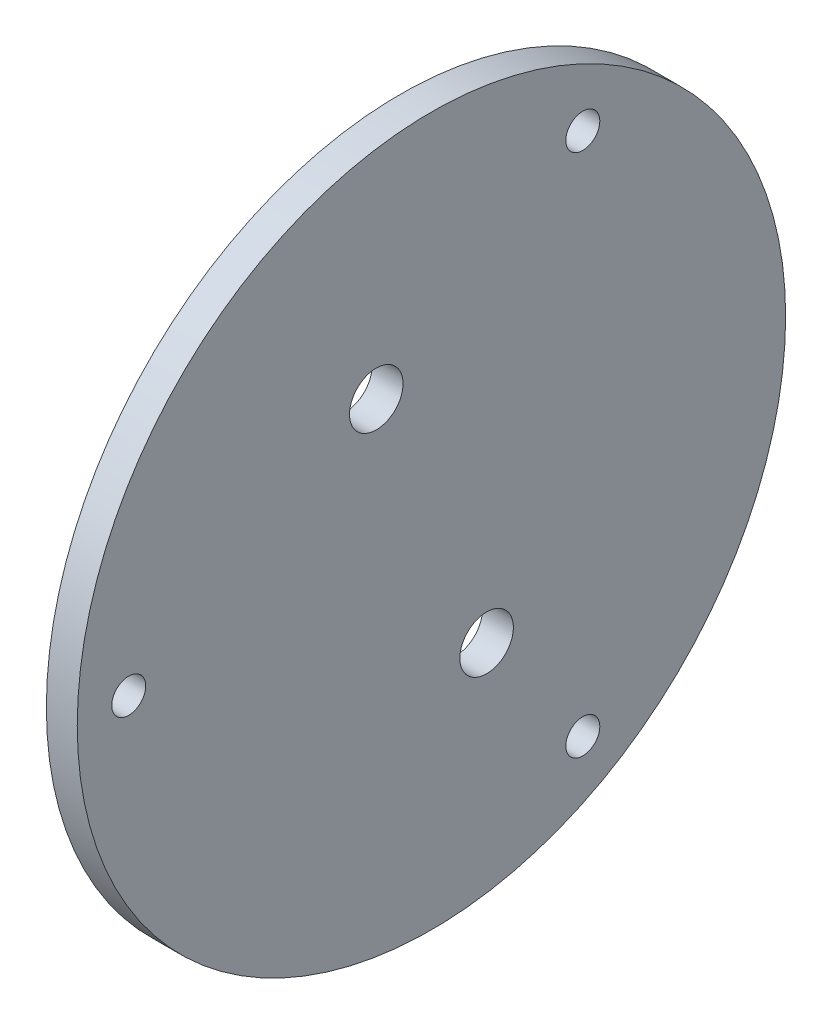
ISO-10303-21;
HEADER;
FILE_DESCRIPTION(('STEP AP214'),'2;1');
FILE_NAME('part.step','',(''),(''),'','','');
FILE_SCHEMA(('AUTOMOTIVE_DESIGN { 1 0 10303 214 1 1 1 1 }'));
ENDSEC;
DATA;
#1=APPLICATION_CONTEXT('core data for automotive mechanical design processes');
#2=APPLICATION_PROTOCOL_DEFINITION('international standard','automotive_design',2000,#1);
#3=PRODUCT_CONTEXT('',#1,'mechanical');
#4=PRODUCT('Part','Part','',(#3));
#5=PRODUCT_RELATED_PRODUCT_CATEGORY('part','',(#4));
#6=PRODUCT_DEFINITION_FORMATION('','',#4);
#7=PRODUCT_DEFINITION_CONTEXT('part definition',#1,'design');
#8=PRODUCT_DEFINITION('design','',#6,#7);
#9=PRODUCT_DEFINITION_SHAPE('','',#8);
#10=(LENGTH_UNIT() NAMED_UNIT(*) SI_UNIT(.MILLI.,.METRE.));
#11=(NAMED_UNIT(*) PLANE_ANGLE_UNIT() SI_UNIT($,.RADIAN.));
#12=(NAMED_UNIT(*) SI_UNIT($,.STERADIAN.) SOLID_ANGLE_UNIT());
#13=UNCERTAINTY_MEASURE_WITH_UNIT(LENGTH_MEASURE(1.E-05),#10,'distance_accuracy_value','');
#14=(GEOMETRIC_REPRESENTATION_CONTEXT(3) GLOBAL_UNCERTAINTY_ASSIGNED_CONTEXT((#13)) GLOBAL_UNIT_ASSIGNED_CONTEXT((#10,
#11,#12)) REPRESENTATION_CONTEXT('',''));
#15=CARTESIAN_POINT('',(0.,0.,0.));
#16=DIRECTION('',(0.,0.,1.));
#17=DIRECTION('',(1.,0.,0.));
#18=AXIS2_PLACEMENT_3D('',#15,#16,#17);
#19=CARTESIAN_POINT('',(156.7,34.4,0.));
#20=DIRECTION('',(1.,0.,0.));
#21=DIRECTION('',(0.,0.,-1.));
#22=AXIS2_PLACEMENT_3D('',#19,#20,#21);
#23=PLANE('',#22);
#24=CARTESIAN_POINT('',(156.7,25.4611468712625,-14.7));
#25=DIRECTION('',(1.,0.,0.));
#26=DIRECTION('',(0.,0.,-1.));
#27=AXIS2_PLACEMENT_3D('',#24,#25,#26);
#28=CIRCLE('',#27,1.65);
#29=CARTESIAN_POINT('',(156.7,25.4611468712625,-16.35));
#30=VERTEX_POINT('',#29);
#31=EDGE_CURVE('E49',#30,#30,#28,.F.);
#32=ORIENTED_EDGE('',*,*,#31,.F.);
#33=EDGE_LOOP('',(#32));
#34=FACE_BOUND('',#33,.T.);
#35=CARTESIAN_POINT('',(156.7,-25.4611468712625,-14.7));
#36=DIRECTION('',(1.,0.,0.));
#37=DIRECTION('',(0.,0.,-1.));
#38=AXIS2_PLACEMENT_3D('',#35,#36,#37);
#39=CIRCLE('',#38,1.65);
#40=CARTESIAN_POINT('',(156.7,-25.4611468712625,-16.35));
#41=VERTEX_POINT('',#40);
#42=EDGE_CURVE('E54',#41,#41,#39,.F.);
#43=ORIENTED_EDGE('',*,*,#42,.F.);
#44=EDGE_LOOP('',(#43));
#45=FACE_BOUND('',#44,.T.);
#46=CARTESIAN_POINT('',(156.7,0.,29.4));
#47=DIRECTION('',(1.,0.,0.));
#48=DIRECTION('',(0.,0.,-1.));
#49=AXIS2_PLACEMENT_3D('',#46,#47,#48);
#50=CIRCLE('',#49,1.65);
#51=CARTESIAN_POINT('',(156.7,0.,27.75));
#52=VERTEX_POINT('',#51);
#53=EDGE_CURVE('E60',#52,#52,#50,.F.);
#54=ORIENTED_EDGE('',*,*,#53,.F.);
#55=EDGE_LOOP('',(#54));
#56=FACE_BOUND('',#55,.T.);
#57=CARTESIAN_POINT('',(156.7,-12.934313455158,-5.35756805311126));
#58=DIRECTION('',(1.,0.,0.));
#59=DIRECTION('',(0.,0.,-1.));
#60=AXIS2_PLACEMENT_3D('',#57,#58,#59);
#61=CIRCLE('',#60,2.6);
#62=CARTESIAN_POINT('',(156.7,-12.934313455158,-7.95756805311126));
#63=VERTEX_POINT('',#62);
#64=EDGE_CURVE('E64',#63,#63,#61,.F.);
#65=ORIENTED_EDGE('',*,*,#64,.F.);
#66=EDGE_LOOP('',(#65));
#67=FACE_BOUND('',#66,.T.);
#68=CARTESIAN_POINT('',(156.7,12.934313455158,5.35756805311126));
#69=DIRECTION('',(1.,0.,0.));
#70=DIRECTION('',(0.,0.,-1.));
#71=AXIS2_PLACEMENT_3D('',#68,#69,#70);
#72=CIRCLE('',#71,2.6);
#73=CARTESIAN_POINT('',(156.7,12.934313455158,2.75756805311126));
#74=VERTEX_POINT('',#73);
#75=EDGE_CURVE('E68',#74,#74,#72,.F.);
#76=ORIENTED_EDGE('',*,*,#75,.F.);
#77=EDGE_LOOP('',(#76));
#78=FACE_BOUND('',#77,.T.);
#79=CARTESIAN_POINT('',(156.7,0.,0.));
#80=DIRECTION('',(-1.,0.,0.));
#81=DIRECTION('',(0.,0.,1.));
#82=AXIS2_PLACEMENT_3D('',#79,#80,#81);
#83=CIRCLE('',#82,34.4);
#84=CARTESIAN_POINT('',(156.7,0.,34.4));
#85=VERTEX_POINT('',#84);
#86=EDGE_CURVE('E44',#85,#85,#83,.T.);
#87=ORIENTED_EDGE('',*,*,#86,.T.);
#88=EDGE_LOOP('',(#87));
#89=FACE_BOUND('',#88,.T.);
#90=ADVANCED_FACE('F37',(#34,#45,#56,#67,#78,#89),#23,.F.);
#91=CARTESIAN_POINT('',(159.7,0.,0.));
#92=DIRECTION('',(-1.,0.,0.));
#93=DIRECTION('',(0.,0.,1.));
#94=AXIS2_PLACEMENT_3D('',#91,#92,#93);
#95=PLANE('',#94);
#96=CARTESIAN_POINT('',(159.7,25.4611468712625,-14.7));
#97=DIRECTION('',(1.,0.,0.));
#98=DIRECTION('',(0.,0.,-1.));
#99=AXIS2_PLACEMENT_3D('',#96,#97,#98);
#100=CIRCLE('',#99,1.65);
#101=CARTESIAN_POINT('',(159.7,25.4611468712625,-16.35));
#102=VERTEX_POINT('',#101);
#103=EDGE_CURVE('E77',#102,#102,#100,.T.);
#104=ORIENTED_EDGE('',*,*,#103,.F.);
#105=EDGE_LOOP('',(#104));
#106=FACE_BOUND('',#105,.T.);
#107=CARTESIAN_POINT('',(159.7,-25.4611468712625,-14.7));
#108=DIRECTION('',(1.,0.,0.));
#109=DIRECTION('',(0.,0.,-1.));
#110=AXIS2_PLACEMENT_3D('',#107,#108,#109);
#111=CIRCLE('',#110,1.65);
#112=CARTESIAN_POINT('',(159.7,-25.4611468712625,-16.35));
#113=VERTEX_POINT('',#112);
#114=EDGE_CURVE('E81',#113,#113,#111,.T.);
#115=ORIENTED_EDGE('',*,*,#114,.F.);
#116=EDGE_LOOP('',(#115));
#117=FACE_BOUND('',#116,.T.);
#118=CARTESIAN_POINT('',(159.7,0.,29.4));
#119=DIRECTION('',(1.,0.,0.));
#120=DIRECTION('',(0.,0.,-1.));
#121=AXIS2_PLACEMENT_3D('',#118,#119,#120);
#122=CIRCLE('',#121,1.65);
#123=CARTESIAN_POINT('',(159.7,0.,27.75));
#124=VERTEX_POINT('',#123);
#125=EDGE_CURVE('E85',#124,#124,#122,.T.);
#126=ORIENTED_EDGE('',*,*,#125,.F.);
#127=EDGE_LOOP('',(#126));
#128=FACE_BOUND('',#127,.T.);
#129=CARTESIAN_POINT('',(159.7,-12.934313455158,-5.35756805311126));
#130=DIRECTION('',(1.,0.,0.));
#131=DIRECTION('',(0.,0.,-1.));
#132=AXIS2_PLACEMENT_3D('',#129,#130,#131);
#133=CIRCLE('',#132,2.6);
#134=CARTESIAN_POINT('',(159.7,-12.934313455158,-7.95756805311126));
#135=VERTEX_POINT('',#134);
#136=EDGE_CURVE('E76',#135,#135,#133,.T.);
#137=ORIENTED_EDGE('',*,*,#136,.F.);
#138=EDGE_LOOP('',(#137));
#139=FACE_BOUND('',#138,.T.);
#140=CARTESIAN_POINT('',(159.7,12.934313455158,5.35756805311126));
#141=DIRECTION('',(1.,0.,0.));
#142=DIRECTION('',(0.,0.,-1.));
#143=AXIS2_PLACEMENT_3D('',#140,#141,#142);
#144=CIRCLE('',#143,2.6);
#145=CARTESIAN_POINT('',(159.7,12.934313455158,2.75756805311126));
#146=VERTEX_POINT('',#145);
#147=EDGE_CURVE('E72',#146,#146,#144,.T.);
#148=ORIENTED_EDGE('',*,*,#147,.F.);
#149=EDGE_LOOP('',(#148));
#150=FACE_BOUND('',#149,.T.);
#151=CARTESIAN_POINT('',(159.7,0.,0.));
#152=DIRECTION('',(-1.,0.,0.));
#153=DIRECTION('',(0.,0.,1.));
#154=AXIS2_PLACEMENT_3D('',#151,#152,#153);
#155=CIRCLE('',#154,34.4);
#156=CARTESIAN_POINT('',(159.7,0.,34.4));
#157=VERTEX_POINT('',#156);
#158=EDGE_CURVE('E10',#157,#157,#155,.T.);
#159=ORIENTED_EDGE('',*,*,#158,.F.);
#160=EDGE_LOOP('',(#159));
#161=FACE_BOUND('',#160,.T.);
#162=ADVANCED_FACE('F96',(#106,#117,#128,#139,#150,#161),#95,.F.);
#163=CARTESIAN_POINT('',(-110.,0.,0.));
#164=DIRECTION('',(-1.,0.,0.));
#165=DIRECTION('',(0.,0.,1.));
#166=AXIS2_PLACEMENT_3D('',#163,#164,#165);
#167=CYLINDRICAL_SURFACE('',#166,34.4);
#168=ORIENTED_EDGE('',*,*,#86,.F.);
#169=EDGE_LOOP('',(#168));
#170=FACE_BOUND('',#169,.T.);
#171=ORIENTED_EDGE('',*,*,#158,.T.);
#172=EDGE_LOOP('',(#171));
#173=FACE_BOUND('',#172,.T.);
#174=ADVANCED_FACE('F99',(#170,#173),#167,.T.);
#175=CARTESIAN_POINT('',(156.7,12.934313455158,5.35756805311126));
#176=DIRECTION('',(-1.,0.,0.));
#177=DIRECTION('',(0.,0.,1.));
#178=AXIS2_PLACEMENT_3D('',#175,#176,#177);
#179=CYLINDRICAL_SURFACE('',#178,2.6);
#180=ORIENTED_EDGE('',*,*,#147,.T.);
#181=EDGE_LOOP('',(#180));
#182=FACE_BOUND('',#181,.T.);
#183=ORIENTED_EDGE('',*,*,#75,.T.);
#184=EDGE_LOOP('',(#183));
#185=FACE_BOUND('',#184,.T.);
#186=ADVANCED_FACE('F104',(#182,#185),#179,.F.);
#187=CARTESIAN_POINT('',(156.7,-12.934313455158,-5.35756805311126));
#188=DIRECTION('',(-1.,0.,0.));
#189=DIRECTION('',(0.,0.,1.));
#190=AXIS2_PLACEMENT_3D('',#187,#188,#189);
#191=CYLINDRICAL_SURFACE('',#190,2.6);
#192=ORIENTED_EDGE('',*,*,#136,.T.);
#193=EDGE_LOOP('',(#192));
#194=FACE_BOUND('',#193,.T.);
#195=ORIENTED_EDGE('',*,*,#64,.T.);
#196=EDGE_LOOP('',(#195));
#197=FACE_BOUND('',#196,.T.);
#198=ADVANCED_FACE('F93',(#194,#197),#191,.F.);
#199=CARTESIAN_POINT('',(156.7,0.,29.4));
#200=DIRECTION('',(-1.,0.,0.));
#201=DIRECTION('',(0.,0.,1.));
#202=AXIS2_PLACEMENT_3D('',#199,#200,#201);
#203=CYLINDRICAL_SURFACE('',#202,1.65);
#204=ORIENTED_EDGE('',*,*,#125,.T.);
#205=EDGE_LOOP('',(#204));
#206=FACE_BOUND('',#205,.T.);
#207=ORIENTED_EDGE('',*,*,#53,.T.);
#208=EDGE_LOOP('',(#207));
#209=FACE_BOUND('',#208,.T.);
#210=ADVANCED_FACE('F122',(#206,#209),#203,.F.);
#211=CARTESIAN_POINT('',(156.7,-25.4611468712625,-14.7));
#212=DIRECTION('',(-1.,0.,0.));
#213=DIRECTION('',(0.,0.,1.));
#214=AXIS2_PLACEMENT_3D('',#211,#212,#213);
#215=CYLINDRICAL_SURFACE('',#214,1.65);
#216=ORIENTED_EDGE('',*,*,#114,.T.);
#217=EDGE_LOOP('',(#216));
#218=FACE_BOUND('',#217,.T.);
#219=ORIENTED_EDGE('',*,*,#42,.T.);
#220=EDGE_LOOP('',(#219));
#221=FACE_BOUND('',#220,.T.);
#222=ADVANCED_FACE('F127',(#218,#221),#215,.F.);
#223=CARTESIAN_POINT('',(156.7,25.4611468712625,-14.7));
#224=DIRECTION('',(-1.,0.,0.));
#225=DIRECTION('',(0.,0.,1.));
#226=AXIS2_PLACEMENT_3D('',#223,#224,#225);
#227=CYLINDRICAL_SURFACE('',#226,1.65);
#228=ORIENTED_EDGE('',*,*,#103,.T.);
#229=EDGE_LOOP('',(#228));
#230=FACE_BOUND('',#229,.T.);
#231=ORIENTED_EDGE('',*,*,#31,.T.);
#232=EDGE_LOOP('',(#231));
#233=FACE_BOUND('',#232,.T.);
#234=ADVANCED_FACE('F133',(#230,#233),#227,.F.);
#235=CLOSED_SHELL('',(#90,#162,#174,#186,#198,#210,#222,#234));
#236=MANIFOLD_SOLID_BREP('B2',#235);
#237=ADVANCED_BREP_SHAPE_REPRESENTATION('',(#18,#236),#14);
#238=SHAPE_DEFINITION_REPRESENTATION(#9,#237);
ENDSEC;
END-ISO-10303-21;
